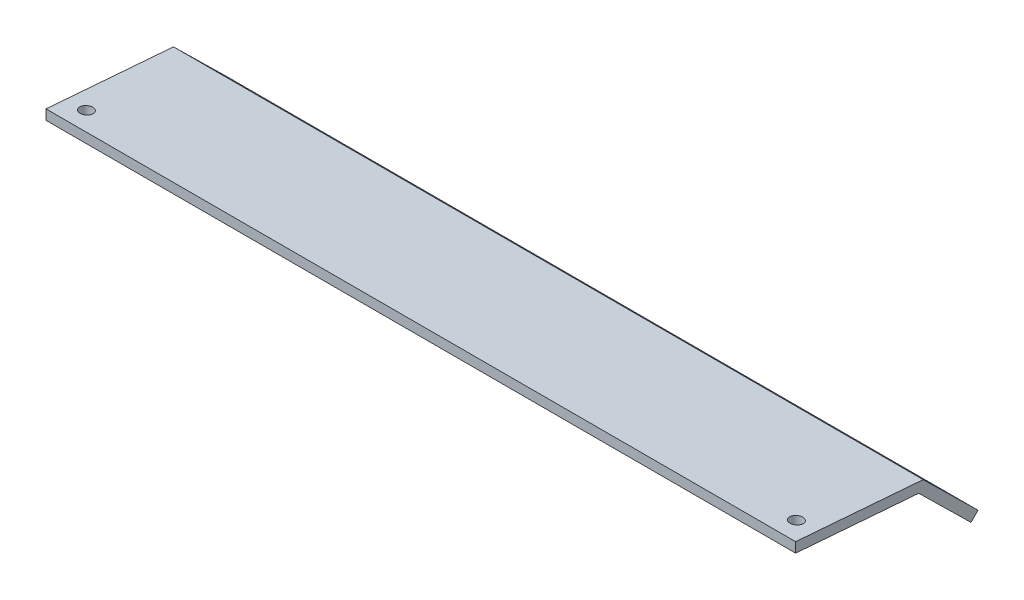
ISO-10303-21;
HEADER;
FILE_DESCRIPTION(('STEP AP214'),'2;1');
FILE_NAME('part.step','',(''),(''),'','','');
FILE_SCHEMA(('AUTOMOTIVE_DESIGN { 1 0 10303 214 1 1 1 1 }'));
ENDSEC;
DATA;
#1=APPLICATION_CONTEXT('core data for automotive mechanical design processes');
#2=APPLICATION_PROTOCOL_DEFINITION('international standard','automotive_design',2000,#1);
#3=PRODUCT_CONTEXT('',#1,'mechanical');
#4=PRODUCT('Part','Part','',(#3));
#5=PRODUCT_RELATED_PRODUCT_CATEGORY('part','',(#4));
#6=PRODUCT_DEFINITION_FORMATION('','',#4);
#7=PRODUCT_DEFINITION_CONTEXT('part definition',#1,'design');
#8=PRODUCT_DEFINITION('design','',#6,#7);
#9=PRODUCT_DEFINITION_SHAPE('','',#8);
#10=(LENGTH_UNIT() NAMED_UNIT(*) SI_UNIT(.MILLI.,.METRE.));
#11=(NAMED_UNIT(*) PLANE_ANGLE_UNIT() SI_UNIT($,.RADIAN.));
#12=(NAMED_UNIT(*) SI_UNIT($,.STERADIAN.) SOLID_ANGLE_UNIT());
#13=UNCERTAINTY_MEASURE_WITH_UNIT(LENGTH_MEASURE(1.E-05),#10,'distance_accuracy_value','');
#14=(GEOMETRIC_REPRESENTATION_CONTEXT(3) GLOBAL_UNCERTAINTY_ASSIGNED_CONTEXT((#13)) GLOBAL_UNIT_ASSIGNED_CONTEXT((#10,
#11,#12)) REPRESENTATION_CONTEXT('',''));
#15=CARTESIAN_POINT('',(0.,0.,0.));
#16=DIRECTION('',(0.,0.,1.));
#17=DIRECTION('',(1.,0.,0.));
#18=AXIS2_PLACEMENT_3D('',#15,#16,#17);
#19=CARTESIAN_POINT('',(119.85625,-3.09687536469946,-39.3617725189904));
#20=DIRECTION('',(0.,0.996919241782115,-0.078434847896659));
#21=DIRECTION('',(0.,0.078434847896659,0.996919241782115));
#22=AXIS2_PLACEMENT_3D('',#19,#20,#21);
#23=PLANE('',#22);
#24=CARTESIAN_POINT('',(113.50625,-0.498447718095402,-6.33534882156455));
#25=DIRECTION('',(0.,0.996919241782115,-0.078434847896659));
#26=DIRECTION('',(0.,0.078434847896659,0.996919241782115));
#27=AXIS2_PLACEMENT_3D('',#24,#25,#26);
#28=CIRCLE('',#27,2.03200000000001);
#29=CARTESIAN_POINT('',(113.50625,-0.33906810716939,-4.30960892226328));
#30=VERTEX_POINT('',#29);
#31=EDGE_CURVE('E140',#30,#30,#28,.T.);
#32=ORIENTED_EDGE('',*,*,#31,.T.);
#33=EDGE_LOOP('',(#32));
#34=FACE_BOUND('',#33,.T.);
#35=CARTESIAN_POINT('',(-113.50625,-0.498447718095395,-6.33534882156446));
#36=DIRECTION('',(0.,0.996919241782115,-0.078434847896659));
#37=DIRECTION('',(0.,0.078434847896659,0.996919241782115));
#38=AXIS2_PLACEMENT_3D('',#35,#36,#37);
#39=CIRCLE('',#38,2.03200000000001);
#40=CARTESIAN_POINT('',(-113.50625,-0.339068107169383,-4.3096089222632));
#41=VERTEX_POINT('',#40);
#42=EDGE_CURVE('E191',#41,#41,#39,.T.);
#43=ORIENTED_EDGE('',*,*,#42,.T.);
#44=EDGE_LOOP('',(#43));
#45=FACE_BOUND('',#44,.T.);
#46=DIRECTION('',(0.,-0.078434847896659,-0.996919241782116));
#47=VECTOR('',#46,1.);
#48=CARTESIAN_POINT('',(-119.85625,-3.09687536469946,-39.3617725189904));
#49=LINE('',#48,#47);
#50=CARTESIAN_POINT('',(-119.85625,0.,0.));
#51=VERTEX_POINT('',#50);
#52=CARTESIAN_POINT('',(-119.85625,-3.09687536469946,-39.3617725189904));
#53=VERTEX_POINT('',#52);
#54=EDGE_CURVE('E136',#51,#53,#49,.T.);
#55=ORIENTED_EDGE('',*,*,#54,.T.);
#56=DIRECTION('',(-1.,0.,0.));
#57=VECTOR('',#56,1.);
#58=CARTESIAN_POINT('',(119.85625,-3.09687536469946,-39.3617725189904));
#59=LINE('',#58,#57);
#60=CARTESIAN_POINT('',(119.85625,-3.09687536469946,-39.3617725189904));
#61=VERTEX_POINT('',#60);
#62=EDGE_CURVE('E11',#61,#53,#59,.T.);
#63=ORIENTED_EDGE('',*,*,#62,.F.);
#64=DIRECTION('',(0.,-0.078434847896659,-0.996919241782116));
#65=VECTOR('',#64,1.);
#66=CARTESIAN_POINT('',(119.85625,-3.09687536469946,-39.3617725189904));
#67=LINE('',#66,#65);
#68=CARTESIAN_POINT('',(119.85625,0.,0.));
#69=VERTEX_POINT('',#68);
#70=EDGE_CURVE('E150',#69,#61,#67,.T.);
#71=ORIENTED_EDGE('',*,*,#70,.F.);
#72=DIRECTION('',(-1.,0.,0.));
#73=VECTOR('',#72,1.);
#74=CARTESIAN_POINT('',(119.85625,0.,0.));
#75=LINE('',#74,#73);
#76=EDGE_CURVE('E132',#69,#51,#75,.T.);
#77=ORIENTED_EDGE('',*,*,#76,.T.);
#78=EDGE_LOOP('',(#55,#63,#71,#77));
#79=FACE_BOUND('',#78,.T.);
#80=ADVANCED_FACE('F43',(#34,#45,#79),#23,.F.);
#81=CARTESIAN_POINT('',(119.85625,-19.5254722041567,-56.0794835425898));
#82=DIRECTION('',(0.,0.713247293097481,-0.700912475912019));
#83=DIRECTION('',(0.,0.700912475912019,0.713247293097481));
#84=AXIS2_PLACEMENT_3D('',#81,#82,#83);
#85=PLANE('',#84);
#86=CARTESIAN_POINT('',(-113.50625,-13.7394397155031,-50.1916271380701));
#87=DIRECTION('',(0.,0.713247293097481,-0.700912475912019));
#88=DIRECTION('',(0.,0.700912475912019,0.713247293097481));
#89=AXIS2_PLACEMENT_3D('',#86,#87,#88);
#90=CIRCLE('',#89,2.03200000000001);
#91=CARTESIAN_POINT('',(-113.50625,-12.3151855644498,-48.742308638496));
#92=VERTEX_POINT('',#91);
#93=EDGE_CURVE('E208',#92,#92,#90,.T.);
#94=ORIENTED_EDGE('',*,*,#93,.T.);
#95=EDGE_LOOP('',(#94));
#96=FACE_BOUND('',#95,.T.);
#97=CARTESIAN_POINT('',(113.50625,-15.9648368265237,-52.4561872936546));
#98=DIRECTION('',(0.,0.713247293097481,-0.700912475912019));
#99=DIRECTION('',(0.,0.700912475912019,0.713247293097481));
#100=AXIS2_PLACEMENT_3D('',#97,#98,#99);
#101=CIRCLE('',#100,2.03200000000001);
#102=CARTESIAN_POINT('',(113.50625,-14.5405826754705,-51.0068687940805));
#103=VERTEX_POINT('',#102);
#104=EDGE_CURVE('E213',#103,#103,#101,.T.);
#105=ORIENTED_EDGE('',*,*,#104,.T.);
#106=EDGE_LOOP('',(#105));
#107=FACE_BOUND('',#106,.T.);
#108=DIRECTION('',(0.,-0.700912475912019,-0.713247293097481));
#109=VECTOR('',#108,1.);
#110=CARTESIAN_POINT('',(-119.85625,-19.5254722041567,-56.0794835425898));
#111=LINE('',#110,#109);
#112=CARTESIAN_POINT('',(-119.85625,-19.5254722041567,-56.0794835425898));
#113=VERTEX_POINT('',#112);
#114=EDGE_CURVE('E139',#53,#113,#111,.T.);
#115=ORIENTED_EDGE('',*,*,#114,.T.);
#116=DIRECTION('',(-1.,0.,0.));
#117=VECTOR('',#116,1.);
#118=CARTESIAN_POINT('',(119.85625,-19.5254722041567,-56.0794835425898));
#119=LINE('',#118,#117);
#120=CARTESIAN_POINT('',(119.85625,-19.5254722041567,-56.0794835425898));
#121=VERTEX_POINT('',#120);
#122=EDGE_CURVE('E51',#121,#113,#119,.T.);
#123=ORIENTED_EDGE('',*,*,#122,.F.);
#124=DIRECTION('',(0.,-0.700912475912019,-0.713247293097481));
#125=VECTOR('',#124,1.);
#126=CARTESIAN_POINT('',(119.85625,-19.5254722041567,-56.0794835425898));
#127=LINE('',#126,#125);
#128=EDGE_CURVE('E99',#61,#121,#127,.T.);
#129=ORIENTED_EDGE('',*,*,#128,.F.);
#130=ORIENTED_EDGE('',*,*,#62,.T.);
#131=EDGE_LOOP('',(#115,#123,#129,#130));
#132=FACE_BOUND('',#131,.T.);
#133=ADVANCED_FACE('F179',(#96,#107,#132),#85,.F.);
#134=CARTESIAN_POINT('',(119.85625,-17.2609120485722,-58.3048806536105));
#135=DIRECTION('',(0.,0.700912475912019,0.713247293097481));
#136=DIRECTION('',(0.,-0.713247293097481,0.700912475912019));
#137=AXIS2_PLACEMENT_3D('',#134,#135,#136);
#138=PLANE('',#137);
#139=DIRECTION('',(0.,0.713247293097481,-0.700912475912019));
#140=VECTOR('',#139,1.);
#141=CARTESIAN_POINT('',(-119.85625,-17.2609120485722,-58.3048806536105));
#142=LINE('',#141,#140);
#143=CARTESIAN_POINT('',(-119.85625,-17.2609120485722,-58.3048806536105));
#144=VERTEX_POINT('',#143);
#145=EDGE_CURVE('E143',#113,#144,#142,.T.);
#146=ORIENTED_EDGE('',*,*,#145,.T.);
#147=DIRECTION('',(-1.,0.,0.));
#148=VECTOR('',#147,1.);
#149=CARTESIAN_POINT('',(119.85625,-17.2609120485722,-58.3048806536105));
#150=LINE('',#149,#148);
#151=CARTESIAN_POINT('',(119.85625,-17.2609120485722,-58.3048806536105));
#152=VERTEX_POINT('',#151);
#153=EDGE_CURVE('E123',#152,#144,#150,.T.);
#154=ORIENTED_EDGE('',*,*,#153,.F.);
#155=DIRECTION('',(0.,0.713247293097481,-0.700912475912019));
#156=VECTOR('',#155,1.);
#157=CARTESIAN_POINT('',(119.85625,-17.2609120485722,-58.3048806536105));
#158=LINE('',#157,#156);
#159=EDGE_CURVE('E113',#121,#152,#158,.T.);
#160=ORIENTED_EDGE('',*,*,#159,.F.);
#161=ORIENTED_EDGE('',*,*,#122,.T.);
#162=EDGE_LOOP('',(#146,#154,#160,#161));
#163=FACE_BOUND('',#162,.T.);
#164=ADVANCED_FACE('F159',(#163),#138,.F.);
#165=CARTESIAN_POINT('',(119.85625,-0.0223005779036735,-40.7629001770682));
#166=DIRECTION('',(0.,-0.713247293097481,0.700912475912019));
#167=DIRECTION('',(0.,-0.700912475912019,-0.713247293097481));
#168=AXIS2_PLACEMENT_3D('',#165,#166,#167);
#169=PLANE('',#168);
#170=CARTESIAN_POINT('',(-113.50625,-11.4748795599185,-52.4170242490908));
#171=DIRECTION('',(0.,0.713247293097481,-0.700912475912019));
#172=DIRECTION('',(0.,0.700912475912019,0.713247293097481));
#173=AXIS2_PLACEMENT_3D('',#170,#171,#172);
#174=CIRCLE('',#173,2.03200000000001);
#175=CARTESIAN_POINT('',(-113.50625,-10.0506254088653,-50.9677057495167));
#176=VERTEX_POINT('',#175);
#177=EDGE_CURVE('E220',#176,#176,#174,.T.);
#178=ORIENTED_EDGE('',*,*,#177,.F.);
#179=EDGE_LOOP('',(#178));
#180=FACE_BOUND('',#179,.T.);
#181=CARTESIAN_POINT('',(113.50625,-13.7002766709392,-54.6815844046753));
#182=DIRECTION('',(0.,0.713247293097481,-0.700912475912019));
#183=DIRECTION('',(0.,0.700912475912019,0.713247293097481));
#184=AXIS2_PLACEMENT_3D('',#181,#182,#183);
#185=CIRCLE('',#184,2.03200000000001);
#186=CARTESIAN_POINT('',(113.50625,-12.276022519886,-53.2322659051012));
#187=VERTEX_POINT('',#186);
#188=EDGE_CURVE('E223',#187,#187,#185,.T.);
#189=ORIENTED_EDGE('',*,*,#188,.F.);
#190=EDGE_LOOP('',(#189));
#191=FACE_BOUND('',#190,.T.);
#192=DIRECTION('',(0.,0.700912475912019,0.713247293097481));
#193=VECTOR('',#192,1.);
#194=CARTESIAN_POINT('',(-119.85625,-0.0223005779036735,-40.7629001770682));
#195=LINE('',#194,#193);
#196=CARTESIAN_POINT('',(-119.85625,-0.0223005779036735,-40.7629001770682));
#197=VERTEX_POINT('',#196);
#198=EDGE_CURVE('E122',#144,#197,#195,.T.);
#199=ORIENTED_EDGE('',*,*,#198,.T.);
#200=DIRECTION('',(-1.,0.,0.));
#201=VECTOR('',#200,1.);
#202=CARTESIAN_POINT('',(119.85625,-0.0223005779036735,-40.7629001770682));
#203=LINE('',#202,#201);
#204=CARTESIAN_POINT('',(119.85625,-0.0223005779036735,-40.7629001770682));
#205=VERTEX_POINT('',#204);
#206=EDGE_CURVE('E119',#205,#197,#203,.T.);
#207=ORIENTED_EDGE('',*,*,#206,.F.);
#208=DIRECTION('',(0.,0.700912475912019,0.713247293097481));
#209=VECTOR('',#208,1.);
#210=CARTESIAN_POINT('',(119.85625,-0.0223005779036735,-40.7629001770682));
#211=LINE('',#210,#209);
#212=EDGE_CURVE('E107',#152,#205,#211,.T.);
#213=ORIENTED_EDGE('',*,*,#212,.F.);
#214=ORIENTED_EDGE('',*,*,#153,.T.);
#215=EDGE_LOOP('',(#199,#207,#213,#214));
#216=FACE_BOUND('',#215,.T.);
#217=ADVANCED_FACE('F120',(#180,#191,#216),#169,.F.);
#218=CARTESIAN_POINT('',(119.85625,3.18481163461576,0.));
#219=DIRECTION('',(0.,-0.996919241782116,0.0784348478966589));
#220=DIRECTION('',(0.,-0.0784348478966589,-0.996919241782116));
#221=AXIS2_PLACEMENT_3D('',#218,#219,#220);
#222=PLANE('',#221);
#223=CARTESIAN_POINT('',(113.50625,2.66677087456282,-6.58437946363644));
#224=DIRECTION('',(0.,0.996919241782115,-0.0784348478966589));
#225=DIRECTION('',(0.,0.0784348478966589,0.996919241782115));
#226=AXIS2_PLACEMENT_3D('',#223,#224,#225);
#227=CIRCLE('',#226,2.03200000000001);
#228=CARTESIAN_POINT('',(113.50625,2.82615048548883,-4.55863956433518));
#229=VERTEX_POINT('',#228);
#230=EDGE_CURVE('E194',#229,#229,#227,.T.);
#231=ORIENTED_EDGE('',*,*,#230,.F.);
#232=EDGE_LOOP('',(#231));
#233=FACE_BOUND('',#232,.T.);
#234=CARTESIAN_POINT('',(-113.50625,2.66677087456282,-6.58437946363635));
#235=DIRECTION('',(0.,0.996919241782115,-0.0784348478966589));
#236=DIRECTION('',(0.,0.0784348478966589,0.996919241782115));
#237=AXIS2_PLACEMENT_3D('',#234,#235,#236);
#238=CIRCLE('',#237,2.03200000000001);
#239=CARTESIAN_POINT('',(-113.50625,2.82615048548883,-4.55863956433509));
#240=VERTEX_POINT('',#239);
#241=EDGE_CURVE('E200',#240,#240,#238,.T.);
#242=ORIENTED_EDGE('',*,*,#241,.F.);
#243=EDGE_LOOP('',(#242));
#244=FACE_BOUND('',#243,.T.);
#245=DIRECTION('',(0.,0.0784348478966589,0.996919241782115));
#246=VECTOR('',#245,1.);
#247=CARTESIAN_POINT('',(-119.85625,3.18481163461576,0.));
#248=LINE('',#247,#246);
#249=CARTESIAN_POINT('',(-119.85625,3.18481163461576,0.));
#250=VERTEX_POINT('',#249);
#251=EDGE_CURVE('E85',#197,#250,#248,.T.);
#252=ORIENTED_EDGE('',*,*,#251,.T.);
#253=DIRECTION('',(-1.,0.,0.));
#254=VECTOR('',#253,1.);
#255=CARTESIAN_POINT('',(119.85625,3.18481163461576,0.));
#256=LINE('',#255,#254);
#257=CARTESIAN_POINT('',(119.85625,3.18481163461576,0.));
#258=VERTEX_POINT('',#257);
#259=EDGE_CURVE('E124',#258,#250,#256,.T.);
#260=ORIENTED_EDGE('',*,*,#259,.F.);
#261=DIRECTION('',(0.,0.0784348478966589,0.996919241782115));
#262=VECTOR('',#261,1.);
#263=CARTESIAN_POINT('',(119.85625,3.18481163461576,0.));
#264=LINE('',#263,#262);
#265=EDGE_CURVE('E111',#205,#258,#264,.T.);
#266=ORIENTED_EDGE('',*,*,#265,.F.);
#267=ORIENTED_EDGE('',*,*,#206,.T.);
#268=EDGE_LOOP('',(#252,#260,#266,#267));
#269=FACE_BOUND('',#268,.T.);
#270=ADVANCED_FACE('F126',(#233,#244,#269),#222,.F.);
#271=CARTESIAN_POINT('',(119.85625,0.,0.));
#272=DIRECTION('',(0.,0.,-1.));
#273=DIRECTION('',(0.,1.,0.));
#274=AXIS2_PLACEMENT_3D('',#271,#272,#273);
#275=PLANE('',#274);
#276=DIRECTION('',(0.,-1.,0.));
#277=VECTOR('',#276,1.);
#278=CARTESIAN_POINT('',(-119.85625,0.,0.));
#279=LINE('',#278,#277);
#280=EDGE_CURVE('E91',#250,#51,#279,.T.);
#281=ORIENTED_EDGE('',*,*,#280,.T.);
#282=ORIENTED_EDGE('',*,*,#76,.F.);
#283=DIRECTION('',(0.,-1.,0.));
#284=VECTOR('',#283,1.);
#285=CARTESIAN_POINT('',(119.85625,0.,0.));
#286=LINE('',#285,#284);
#287=EDGE_CURVE('E61',#258,#69,#286,.T.);
#288=ORIENTED_EDGE('',*,*,#287,.F.);
#289=ORIENTED_EDGE('',*,*,#259,.T.);
#290=EDGE_LOOP('',(#281,#282,#288,#289));
#291=FACE_BOUND('',#290,.T.);
#292=ADVANCED_FACE('F166',(#291),#275,.F.);
#293=CARTESIAN_POINT('',(119.85625,0.,0.));
#294=DIRECTION('',(-1.,0.,0.));
#295=DIRECTION('',(0.,0.,1.));
#296=AXIS2_PLACEMENT_3D('',#293,#294,#295);
#297=PLANE('',#296);
#298=ORIENTED_EDGE('',*,*,#70,.T.);
#299=ORIENTED_EDGE('',*,*,#128,.T.);
#300=ORIENTED_EDGE('',*,*,#159,.T.);
#301=ORIENTED_EDGE('',*,*,#212,.T.);
#302=ORIENTED_EDGE('',*,*,#265,.T.);
#303=ORIENTED_EDGE('',*,*,#287,.T.);
#304=EDGE_LOOP('',(#298,#299,#300,#301,#302,#303));
#305=FACE_BOUND('',#304,.T.);
#306=ADVANCED_FACE('F109',(#305),#297,.F.);
#307=CARTESIAN_POINT('',(-119.85625,0.,0.));
#308=DIRECTION('',(-1.,0.,0.));
#309=DIRECTION('',(0.,0.,1.));
#310=AXIS2_PLACEMENT_3D('',#307,#308,#309);
#311=PLANE('',#310);
#312=ORIENTED_EDGE('',*,*,#54,.F.);
#313=ORIENTED_EDGE('',*,*,#280,.F.);
#314=ORIENTED_EDGE('',*,*,#251,.F.);
#315=ORIENTED_EDGE('',*,*,#198,.F.);
#316=ORIENTED_EDGE('',*,*,#145,.F.);
#317=ORIENTED_EDGE('',*,*,#114,.F.);
#318=EDGE_LOOP('',(#312,#313,#314,#315,#316,#317));
#319=FACE_BOUND('',#318,.T.);
#320=ADVANCED_FACE('F162',(#319),#311,.T.);
#321=CARTESIAN_POINT('',(-113.50625,-19.9037987219969,-4.8085894908373));
#322=DIRECTION('',(0.,0.996919241782116,-0.0784348478966589));
#323=DIRECTION('',(0.,0.0784348478966589,0.996919241782116));
#324=AXIS2_PLACEMENT_3D('',#321,#322,#323);
#325=CYLINDRICAL_SURFACE('',#324,2.03200000000001);
#326=ORIENTED_EDGE('',*,*,#241,.T.);
#327=EDGE_LOOP('',(#326));
#328=FACE_BOUND('',#327,.T.);
#329=ORIENTED_EDGE('',*,*,#42,.F.);
#330=EDGE_LOOP('',(#329));
#331=FACE_BOUND('',#330,.T.);
#332=ADVANCED_FACE('F249',(#328,#331),#325,.F.);
#333=CARTESIAN_POINT('',(113.50625,-19.9037987219969,-4.80858949083739));
#334=DIRECTION('',(0.,0.996919241782116,-0.0784348478966589));
#335=DIRECTION('',(0.,0.0784348478966589,0.996919241782116));
#336=AXIS2_PLACEMENT_3D('',#333,#334,#335);
#337=CYLINDRICAL_SURFACE('',#336,2.03200000000001);
#338=ORIENTED_EDGE('',*,*,#230,.T.);
#339=EDGE_LOOP('',(#338));
#340=FACE_BOUND('',#339,.T.);
#341=ORIENTED_EDGE('',*,*,#31,.F.);
#342=EDGE_LOOP('',(#341));
#343=FACE_BOUND('',#342,.T.);
#344=ADVANCED_FACE('F240',(#340,#343),#337,.F.);
#345=CARTESIAN_POINT('',(113.50625,-22.7585172932772,-45.7799959605927));
#346=DIRECTION('',(0.,0.713247293097481,-0.700912475912019));
#347=DIRECTION('',(0.,0.700912475912019,0.713247293097481));
#348=AXIS2_PLACEMENT_3D('',#345,#346,#347);
#349=CYLINDRICAL_SURFACE('',#348,2.03200000000001);
#350=CARTESIAN_POINT('',(113.50625,-12.276022519886,-53.2322659051012));
#351=CARTESIAN_POINT('',(113.50625,-12.2996116881733,-53.2090846851947));
#352=CARTESIAN_POINT('',(113.50625,-12.3232008564607,-53.1859034652883));
#353=CARTESIAN_POINT('',(113.50625,-12.3703791930353,-53.1395410254753));
#354=CARTESIAN_POINT('',(113.50625,-12.3939683613227,-53.1163598055689));
#355=CARTESIAN_POINT('',(113.50625,-12.4411466978973,-53.0699973657559));
#356=CARTESIAN_POINT('',(113.50625,-12.4647358661847,-53.0468161458495));
#357=CARTESIAN_POINT('',(113.50625,-12.5119142027594,-53.0004537060365));
#358=CARTESIAN_POINT('',(113.50625,-12.5355033710467,-52.9772724861301));
#359=CARTESIAN_POINT('',(113.50625,-12.5826817076214,-52.9309100463172));
#360=CARTESIAN_POINT('',(113.50625,-12.6062708759087,-52.9077288264107));
#361=CARTESIAN_POINT('',(113.50625,-12.6534492124834,-52.8613663865978));
#362=CARTESIAN_POINT('',(113.50625,-12.6770383807707,-52.8381851666913));
#363=CARTESIAN_POINT('',(113.50625,-12.7242167173454,-52.7918227268784));
#364=CARTESIAN_POINT('',(113.50625,-12.7478058856328,-52.7686415069719));
#365=CARTESIAN_POINT('',(113.50625,-12.7949842222074,-52.722279067159));
#366=CARTESIAN_POINT('',(113.50625,-12.8185733904948,-52.6990978472525));
#367=CARTESIAN_POINT('',(113.50625,-12.8657517270694,-52.6527354074396));
#368=CARTESIAN_POINT('',(113.50625,-12.8893408953568,-52.6295541875331));
#369=CARTESIAN_POINT('',(113.50625,-12.9365192319315,-52.5831917477202));
#370=CARTESIAN_POINT('',(113.50625,-12.9601084002188,-52.5600105278137));
#371=CARTESIAN_POINT('',(113.50625,-13.0072867367935,-52.5136480880008));
#372=CARTESIAN_POINT('',(113.50625,-13.0308759050808,-52.4904668680943));
#373=CARTESIAN_POINT('',(113.50625,-13.0780542416555,-52.4441044282814));
#374=CARTESIAN_POINT('',(113.50625,-13.1016434099428,-52.4209232083749));
#375=CARTESIAN_POINT('',(113.50625,-13.1488217465175,-52.374560768562));
#376=CARTESIAN_POINT('',(113.50625,-13.1724109148048,-52.3513795486555));
#377=CARTESIAN_POINT('',(113.50625,-13.2195892513795,-52.3050171088426));
#378=CARTESIAN_POINT('',(113.50625,-13.2431784196669,-52.2818358889361));
#379=CARTESIAN_POINT('',(113.50625,-13.2903567562415,-52.2354734491232));
#380=CARTESIAN_POINT('',(113.50625,-13.3139459245289,-52.2122922292167));
#381=CARTESIAN_POINT('',(113.50625,-13.3611242611036,-52.1659297894038));
#382=CARTESIAN_POINT('',(113.50625,-13.3847134293909,-52.1427485694973));
#383=CARTESIAN_POINT('',(113.50625,-13.4318917659656,-52.0963861296844));
#384=CARTESIAN_POINT('',(113.50625,-13.4554809342529,-52.0732049097779));
#385=CARTESIAN_POINT('',(113.50625,-13.5026592708276,-52.026842469965));
#386=CARTESIAN_POINT('',(113.50625,-13.5262484391149,-52.0036612500585));
#387=CARTESIAN_POINT('',(113.50625,-13.5734267756896,-51.9572988102456));
#388=CARTESIAN_POINT('',(113.50625,-13.5970159439769,-51.9341175903391));
#389=CARTESIAN_POINT('',(113.50625,-13.6441942805516,-51.8877551505262));
#390=CARTESIAN_POINT('',(113.50625,-13.667783448839,-51.8645739306197));
#391=CARTESIAN_POINT('',(113.50625,-13.7149617854136,-51.8182114908068));
#392=CARTESIAN_POINT('',(113.50625,-13.738550953701,-51.7950302709003));
#393=CARTESIAN_POINT('',(113.50625,-13.7857292902756,-51.7486678310874));
#394=CARTESIAN_POINT('',(113.50625,-13.809318458563,-51.725486611181));
#395=CARTESIAN_POINT('',(113.50625,-13.8564967951377,-51.679124171368));
#396=CARTESIAN_POINT('',(113.50625,-13.880085963425,-51.6559429514616));
#397=CARTESIAN_POINT('',(113.50625,-13.9272642999997,-51.6095805116486));
#398=CARTESIAN_POINT('',(113.50625,-13.950853468287,-51.5863992917422));
#399=CARTESIAN_POINT('',(113.50625,-13.9980318048617,-51.5400368519292));
#400=CARTESIAN_POINT('',(113.50625,-14.021620973149,-51.5168556320228));
#401=CARTESIAN_POINT('',(113.50625,-14.0687993097237,-51.4704931922098));
#402=CARTESIAN_POINT('',(113.50625,-14.092388478011,-51.4473119723034));
#403=CARTESIAN_POINT('',(113.50625,-14.1395668145857,-51.4009495324904));
#404=CARTESIAN_POINT('',(113.50625,-14.1631559828731,-51.377768312584));
#405=CARTESIAN_POINT('',(113.50625,-14.2103343194477,-51.331405872771));
#406=CARTESIAN_POINT('',(113.50625,-14.2339234877351,-51.3082246528646));
#407=CARTESIAN_POINT('',(113.50625,-14.2811018243098,-51.2618622130516));
#408=CARTESIAN_POINT('',(113.50625,-14.3046909925971,-51.2386809931452));
#409=CARTESIAN_POINT('',(113.50625,-14.3518693291718,-51.1923185533323));
#410=CARTESIAN_POINT('',(113.50625,-14.3754584974591,-51.1691373334258));
#411=CARTESIAN_POINT('',(113.50625,-14.4226368340338,-51.1227748936129));
#412=CARTESIAN_POINT('',(113.50625,-14.4462260023211,-51.0995936737064));
#413=CARTESIAN_POINT('',(113.50625,-14.4934043388958,-51.0532312338935));
#414=CARTESIAN_POINT('',(113.50625,-14.5169935071831,-51.030050013987));
#415=CARTESIAN_POINT('',(113.50625,-14.5405826754705,-51.0068687940805));
#416=B_SPLINE_CURVE_WITH_KNOTS('',3,(#350,#351,#352,#353,#354,#355,#356,#357,#358,#359,#360,
#361,#362,#363,#364,#365,#366,#367,#368,#369,#370,#371,#372,#373,#374,#375,#376,#377,#378,#379,
#380,#381,#382,#383,#384,#385,#386,#387,#388,#389,#390,#391,#392,#393,#394,#395,#396,#397,#398,
#399,#400,#401,#402,#403,#404,#405,#406,#407,#408,#409,#410,#411,#412,#413,#414,#415),
.UNSPECIFIED.,.F.,.F.,(4,2,2,2,2,2,2,2,2,2,2,2,2,2,2,2,2,2,2,2,2,2,2,2,2,2,2,2,2,2,2,2,4),(0.,
0.0992187500000002,0.1984375,0.297656249999999,0.396875000000001,0.49609375,0.5953125,
0.69453125,0.793749999999999,0.89296875,0.9921875,1.09140625,1.190625,1.28984375,1.3890625,
1.48828125,1.5875,1.68671875,1.7859375,1.88515625,1.984375,2.08359375,2.1828125,
2.28203125000001,2.38125,2.48046875,2.5796875,2.67890625,2.778125,2.87734375,2.9765625,
3.07578125,3.17500000000001),.UNSPECIFIED.);
#417=EDGE_CURVE('BSEAM237',#187,#103,#416,.T.);
#418=ORIENTED_EDGE('',*,*,#188,.T.);
#419=ORIENTED_EDGE('',*,*,#104,.F.);
#420=ORIENTED_EDGE('',*,*,#417,.T.);
#421=ORIENTED_EDGE('',*,*,#417,.F.);
#422=EDGE_LOOP('',(#418,#420,#419,#421));
#423=FACE_BOUND('',#422,.T.);
#424=ADVANCED_FACE('F237',(#423),#349,.F.);
#425=CARTESIAN_POINT('',(-113.50625,-20.5331201822566,-43.5154358050081));
#426=DIRECTION('',(0.,0.713247293097481,-0.700912475912019));
#427=DIRECTION('',(0.,0.700912475912019,0.713247293097481));
#428=AXIS2_PLACEMENT_3D('',#425,#426,#427);
#429=CYLINDRICAL_SURFACE('',#428,2.03200000000001);
#430=CARTESIAN_POINT('',(-113.50625,-10.0506254088653,-50.9677057495167));
#431=CARTESIAN_POINT('',(-113.50625,-10.0742145771527,-50.9445245296102));
#432=CARTESIAN_POINT('',(-113.50625,-10.09780374544,-50.9213433097038));
#433=CARTESIAN_POINT('',(-113.50625,-10.1449820820147,-50.8749808698908));
#434=CARTESIAN_POINT('',(-113.50625,-10.168571250302,-50.8517996499844));
#435=CARTESIAN_POINT('',(-113.50625,-10.2157495868767,-50.8054372101714));
#436=CARTESIAN_POINT('',(-113.50625,-10.239338755164,-50.782255990265));
#437=CARTESIAN_POINT('',(-113.50625,-10.2865170917387,-50.735893550452));
#438=CARTESIAN_POINT('',(-113.50625,-10.310106260026,-50.7127123305456));
#439=CARTESIAN_POINT('',(-113.50625,-10.3572845966007,-50.6663498907326));
#440=CARTESIAN_POINT('',(-113.50625,-10.3808737648881,-50.6431686708262));
#441=CARTESIAN_POINT('',(-113.50625,-10.4280521014627,-50.5968062310133));
#442=CARTESIAN_POINT('',(-113.50625,-10.4516412697501,-50.5736250111068));
#443=CARTESIAN_POINT('',(-113.50625,-10.4988196063247,-50.5272625712939));
#444=CARTESIAN_POINT('',(-113.50625,-10.5224087746121,-50.5040813513874));
#445=CARTESIAN_POINT('',(-113.50625,-10.5695871111868,-50.4577189115745));
#446=CARTESIAN_POINT('',(-113.50625,-10.5931762794741,-50.434537691668));
#447=CARTESIAN_POINT('',(-113.50625,-10.6403546160488,-50.3881752518551));
#448=CARTESIAN_POINT('',(-113.50625,-10.6639437843361,-50.3649940319486));
#449=CARTESIAN_POINT('',(-113.50625,-10.7111221209108,-50.3186315921357));
#450=CARTESIAN_POINT('',(-113.50625,-10.7347112891981,-50.2954503722292));
#451=CARTESIAN_POINT('',(-113.50625,-10.7818896257728,-50.2490879324163));
#452=CARTESIAN_POINT('',(-113.50625,-10.8054787940602,-50.2259067125098));
#453=CARTESIAN_POINT('',(-113.50625,-10.8526571306348,-50.1795442726969));
#454=CARTESIAN_POINT('',(-113.50625,-10.8762462989222,-50.1563630527904));
#455=CARTESIAN_POINT('',(-113.50625,-10.9234246354968,-50.1100006129775));
#456=CARTESIAN_POINT('',(-113.50625,-10.9470138037842,-50.086819393071));
#457=CARTESIAN_POINT('',(-113.50625,-10.9941921403589,-50.0404569532581));
#458=CARTESIAN_POINT('',(-113.50625,-11.0177813086462,-50.0172757333516));
#459=CARTESIAN_POINT('',(-113.50625,-11.0649596452209,-49.9709132935387));
#460=CARTESIAN_POINT('',(-113.50625,-11.0885488135082,-49.9477320736322));
#461=CARTESIAN_POINT('',(-113.50625,-11.1357271500829,-49.9013696338193));
#462=CARTESIAN_POINT('',(-113.50625,-11.1593163183702,-49.8781884139128));
#463=CARTESIAN_POINT('',(-113.50625,-11.2064946549449,-49.8318259740999));
#464=CARTESIAN_POINT('',(-113.50625,-11.2300838232322,-49.8086447541934));
#465=CARTESIAN_POINT('',(-113.50625,-11.2772621598069,-49.7622823143805));
#466=CARTESIAN_POINT('',(-113.50625,-11.3008513280943,-49.739101094474));
#467=CARTESIAN_POINT('',(-113.50625,-11.3480296646689,-49.6927386546611));
#468=CARTESIAN_POINT('',(-113.50625,-11.3716188329563,-49.6695574347546));
#469=CARTESIAN_POINT('',(-113.50625,-11.418797169531,-49.6231949949417));
#470=CARTESIAN_POINT('',(-113.50625,-11.4423863378183,-49.6000137750352));
#471=CARTESIAN_POINT('',(-113.50625,-11.489564674393,-49.5536513352223));
#472=CARTESIAN_POINT('',(-113.50625,-11.5131538426803,-49.5304701153159));
#473=CARTESIAN_POINT('',(-113.50625,-11.560332179255,-49.4841076755029));
#474=CARTESIAN_POINT('',(-113.50625,-11.5839213475423,-49.4609264555965));
#475=CARTESIAN_POINT('',(-113.50625,-11.631099684117,-49.4145640157835));
#476=CARTESIAN_POINT('',(-113.50625,-11.6546888524043,-49.3913827958771));
#477=CARTESIAN_POINT('',(-113.50625,-11.701867188979,-49.3450203560641));
#478=CARTESIAN_POINT('',(-113.50625,-11.7254563572664,-49.3218391361577));
#479=CARTESIAN_POINT('',(-113.50625,-11.772634693841,-49.2754766963447));
#480=CARTESIAN_POINT('',(-113.50625,-11.7962238621284,-49.2522954764383));
#481=CARTESIAN_POINT('',(-113.50625,-11.8434021987031,-49.2059330366253));
#482=CARTESIAN_POINT('',(-113.50625,-11.8669913669904,-49.1827518167189));
#483=CARTESIAN_POINT('',(-113.50625,-11.9141697035651,-49.1363893769059));
#484=CARTESIAN_POINT('',(-113.50625,-11.9377588718524,-49.1132081569995));
#485=CARTESIAN_POINT('',(-113.50625,-11.9849372084271,-49.0668457171865));
#486=CARTESIAN_POINT('',(-113.50625,-12.0085263767144,-49.0436644972801));
#487=CARTESIAN_POINT('',(-113.50625,-12.0557047132891,-48.9973020574671));
#488=CARTESIAN_POINT('',(-113.50625,-12.0792938815764,-48.9741208375607));
#489=CARTESIAN_POINT('',(-113.50625,-12.1264722181511,-48.9277583977478));
#490=CARTESIAN_POINT('',(-113.50625,-12.1500613864385,-48.9045771778413));
#491=CARTESIAN_POINT('',(-113.50625,-12.1972397230131,-48.8582147380284));
#492=CARTESIAN_POINT('',(-113.50625,-12.2208288913005,-48.8350335181219));
#493=CARTESIAN_POINT('',(-113.50625,-12.2680072278751,-48.788671078309));
#494=CARTESIAN_POINT('',(-113.50625,-12.2915963961625,-48.7654898584025));
#495=CARTESIAN_POINT('',(-113.50625,-12.3151855644498,-48.742308638496));
#496=B_SPLINE_CURVE_WITH_KNOTS('',3,(#430,#431,#432,#433,#434,#435,#436,#437,#438,#439,#440,
#441,#442,#443,#444,#445,#446,#447,#448,#449,#450,#451,#452,#453,#454,#455,#456,#457,#458,#459,
#460,#461,#462,#463,#464,#465,#466,#467,#468,#469,#470,#471,#472,#473,#474,#475,#476,#477,#478,
#479,#480,#481,#482,#483,#484,#485,#486,#487,#488,#489,#490,#491,#492,#493,#494,#495),
.UNSPECIFIED.,.F.,.F.,(4,2,2,2,2,2,2,2,2,2,2,2,2,2,2,2,2,2,2,2,2,2,2,2,2,2,2,2,2,2,2,2,4),(0.,
0.0992187500000002,0.1984375,0.297656249999999,0.396875000000001,0.49609375,0.5953125,
0.69453125,0.793750000000001,0.892968750000001,0.9921875,1.09140625,1.190625,1.28984375000001,
1.3890625,1.48828125000001,1.58750000000001,1.68671875,1.78593750000001,1.88515625000001,
1.98437500000001,2.08359375,2.18281250000001,2.28203125000001,2.38125000000001,2.48046875000001,
2.57968750000001,2.67890625000001,2.77812500000001,2.87734375000001,2.97656250000001,
3.07578125000001,3.17500000000001),.UNSPECIFIED.);
#497=EDGE_CURVE('BSEAM229',#176,#92,#496,.T.);
#498=ORIENTED_EDGE('',*,*,#177,.T.);
#499=ORIENTED_EDGE('',*,*,#93,.F.);
#500=ORIENTED_EDGE('',*,*,#497,.T.);
#501=ORIENTED_EDGE('',*,*,#497,.F.);
#502=EDGE_LOOP('',(#498,#500,#499,#501));
#503=FACE_BOUND('',#502,.T.);
#504=ADVANCED_FACE('F229',(#503),#429,.F.);
#505=CLOSED_SHELL('',(#80,#133,#164,#217,#270,#292,#306,#320,#332,#344,#424,#504));
#506=MANIFOLD_SOLID_BREP('B2',#505);
#507=ADVANCED_BREP_SHAPE_REPRESENTATION('',(#18,#506),#14);
#508=SHAPE_DEFINITION_REPRESENTATION(#9,#507);
ENDSEC;
END-ISO-10303-21;
